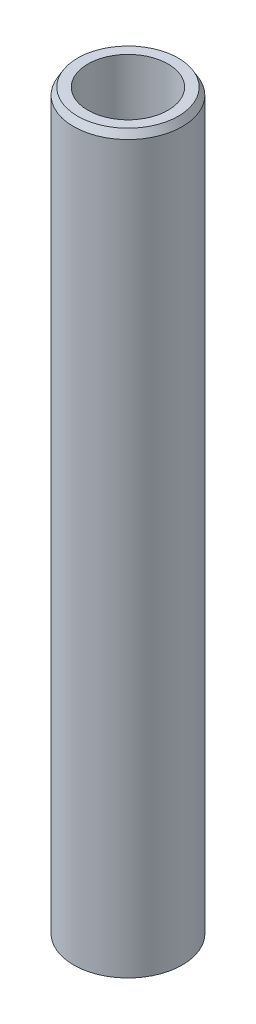
ISO-10303-21;
HEADER;
FILE_DESCRIPTION(('STEP AP214'),'2;1');
FILE_NAME('part.step','',(''),(''),'','','');
FILE_SCHEMA(('AUTOMOTIVE_DESIGN { 1 0 10303 214 1 1 1 1 }'));
ENDSEC;
DATA;
#1=APPLICATION_CONTEXT('core data for automotive mechanical design processes');
#2=APPLICATION_PROTOCOL_DEFINITION('international standard','automotive_design',2000,#1);
#3=PRODUCT_CONTEXT('',#1,'mechanical');
#4=PRODUCT('Part','Part','',(#3));
#5=PRODUCT_RELATED_PRODUCT_CATEGORY('part','',(#4));
#6=PRODUCT_DEFINITION_FORMATION('','',#4);
#7=PRODUCT_DEFINITION_CONTEXT('part definition',#1,'design');
#8=PRODUCT_DEFINITION('design','',#6,#7);
#9=PRODUCT_DEFINITION_SHAPE('','',#8);
#10=(LENGTH_UNIT() NAMED_UNIT(*) SI_UNIT(.MILLI.,.METRE.));
#11=(NAMED_UNIT(*) PLANE_ANGLE_UNIT() SI_UNIT($,.RADIAN.));
#12=(NAMED_UNIT(*) SI_UNIT($,.STERADIAN.) SOLID_ANGLE_UNIT());
#13=UNCERTAINTY_MEASURE_WITH_UNIT(LENGTH_MEASURE(1.E-05),#10,'distance_accuracy_value','');
#14=(GEOMETRIC_REPRESENTATION_CONTEXT(3) GLOBAL_UNCERTAINTY_ASSIGNED_CONTEXT((#13)) GLOBAL_UNIT_ASSIGNED_CONTEXT((#10,
#11,#12)) REPRESENTATION_CONTEXT('',''));
#15=CARTESIAN_POINT('',(0.,0.,0.));
#16=DIRECTION('',(0.,0.,1.));
#17=DIRECTION('',(1.,0.,0.));
#18=AXIS2_PLACEMENT_3D('',#15,#16,#17);
#19=CARTESIAN_POINT('',(0.,508.202251335451,0.));
#20=DIRECTION('',(0.,-1.,0.));
#21=DIRECTION('',(0.,0.,-1.));
#22=AXIS2_PLACEMENT_3D('',#19,#20,#21);
#23=CYLINDRICAL_SURFACE('',#22,37.5);
#24=CARTESIAN_POINT('',(0.,503.381000509019,0.));
#25=DIRECTION('',(0.,1.,0.));
#26=DIRECTION('',(0.,0.,1.));
#27=AXIS2_PLACEMENT_3D('',#24,#25,#26);
#28=CIRCLE('',#27,37.5);
#29=CARTESIAN_POINT('',(0.,503.381000509019,37.5));
#30=VERTEX_POINT('',#29);
#31=EDGE_CURVE('E50',#30,#30,#28,.F.);
#32=ORIENTED_EDGE('',*,*,#31,.T.);
#33=EDGE_LOOP('',(#32));
#34=FACE_BOUND('',#33,.T.);
#35=CARTESIAN_POINT('',(0.,2.78355046247136,0.));
#36=DIRECTION('',(0.,1.,0.));
#37=DIRECTION('',(0.,0.,1.));
#38=AXIS2_PLACEMENT_3D('',#35,#36,#37);
#39=CIRCLE('',#38,37.5);
#40=CARTESIAN_POINT('',(0.,2.78355046247136,37.5));
#41=VERTEX_POINT('',#40);
#42=EDGE_CURVE('E51',#41,#41,#39,.T.);
#43=ORIENTED_EDGE('',*,*,#42,.T.);
#44=EDGE_LOOP('',(#43));
#45=FACE_BOUND('',#44,.T.);
#46=ADVANCED_FACE('F39',(#34,#45),#23,.T.);
#47=CARTESIAN_POINT('',(0.,508.202251335451,0.));
#48=DIRECTION('',(0.,1.,0.));
#49=DIRECTION('',(0.,0.,1.));
#50=AXIS2_PLACEMENT_3D('',#47,#48,#49);
#51=PLANE('',#50);
#52=CARTESIAN_POINT('',(0.,508.202251335451,0.));
#53=DIRECTION('',(0.,1.,0.));
#54=DIRECTION('',(0.,0.,1.));
#55=AXIS2_PLACEMENT_3D('',#52,#53,#54);
#56=CIRCLE('',#55,34.7164495375286);
#57=CARTESIAN_POINT('',(0.,508.202251335451,34.7164495375286));
#58=VERTEX_POINT('',#57);
#59=EDGE_CURVE('E54',#58,#58,#56,.T.);
#60=ORIENTED_EDGE('',*,*,#59,.T.);
#61=EDGE_LOOP('',(#60));
#62=FACE_BOUND('',#61,.T.);
#63=CARTESIAN_POINT('',(0.,508.202251335451,0.));
#64=DIRECTION('',(0.,1.,0.));
#65=DIRECTION('',(0.,0.,1.));
#66=AXIS2_PLACEMENT_3D('',#63,#64,#65);
#67=CIRCLE('',#66,27.6466497342233);
#68=CARTESIAN_POINT('',(0.,508.202251335451,27.6466497342233));
#69=VERTEX_POINT('',#68);
#70=EDGE_CURVE('E58',#69,#69,#67,.T.);
#71=ORIENTED_EDGE('',*,*,#70,.F.);
#72=EDGE_LOOP('',(#71));
#73=FACE_BOUND('',#72,.T.);
#74=ADVANCED_FACE('F69',(#62,#73),#51,.T.);
#75=CARTESIAN_POINT('',(0.,0.,0.));
#76=DIRECTION('',(0.,1.,0.));
#77=DIRECTION('',(0.,0.,1.));
#78=AXIS2_PLACEMENT_3D('',#75,#76,#77);
#79=PLANE('',#78);
#80=CARTESIAN_POINT('',(0.,0.,0.));
#81=DIRECTION('',(0.,1.,0.));
#82=DIRECTION('',(0.,0.,1.));
#83=AXIS2_PLACEMENT_3D('',#80,#81,#82);
#84=CIRCLE('',#83,32.6787491735678);
#85=CARTESIAN_POINT('',(0.,0.,32.6787491735678));
#86=VERTEX_POINT('',#85);
#87=EDGE_CURVE('E10',#86,#86,#84,.F.);
#88=ORIENTED_EDGE('',*,*,#87,.T.);
#89=EDGE_LOOP('',(#88));
#90=FACE_BOUND('',#89,.T.);
#91=CARTESIAN_POINT('',(0.,0.,0.));
#92=DIRECTION('',(0.,1.,0.));
#93=DIRECTION('',(0.,0.,1.));
#94=AXIS2_PLACEMENT_3D('',#91,#92,#93);
#95=CIRCLE('',#94,27.6466497342233);
#96=CARTESIAN_POINT('',(0.,0.,27.6466497342233));
#97=VERTEX_POINT('',#96);
#98=EDGE_CURVE('E63',#97,#97,#95,.T.);
#99=ORIENTED_EDGE('',*,*,#98,.T.);
#100=EDGE_LOOP('',(#99));
#101=FACE_BOUND('',#100,.T.);
#102=ADVANCED_FACE('F75',(#90,#101),#79,.F.);
#103=CARTESIAN_POINT('',(0.,508.202251335451,0.));
#104=DIRECTION('',(0.,-1.,0.));
#105=DIRECTION('',(0.,0.,-1.));
#106=AXIS2_PLACEMENT_3D('',#103,#104,#105);
#107=CYLINDRICAL_SURFACE('',#106,27.6466497342233);
#108=ORIENTED_EDGE('',*,*,#70,.T.);
#109=EDGE_LOOP('',(#108));
#110=FACE_BOUND('',#109,.T.);
#111=ORIENTED_EDGE('',*,*,#98,.F.);
#112=EDGE_LOOP('',(#111));
#113=FACE_BOUND('',#112,.T.);
#114=ADVANCED_FACE('F70',(#110,#113),#107,.F.);
#115=CARTESIAN_POINT('',(0.,508.202251335451,0.));
#116=DIRECTION('',(0.,-1.,0.));
#117=DIRECTION('',(0.,0.,-1.));
#118=AXIS2_PLACEMENT_3D('',#115,#116,#117);
#119=CONICAL_SURFACE('',#118,34.7164495375286,0.523598775598302);
#120=ORIENTED_EDGE('',*,*,#31,.F.);
#121=EDGE_LOOP('',(#120));
#122=FACE_BOUND('',#121,.T.);
#123=ORIENTED_EDGE('',*,*,#59,.F.);
#124=EDGE_LOOP('',(#123));
#125=FACE_BOUND('',#124,.T.);
#126=ADVANCED_FACE('F81',(#122,#125),#119,.T.);
#127=CARTESIAN_POINT('',(0.,2.78355046247136,0.));
#128=DIRECTION('',(0.,1.,0.));
#129=DIRECTION('',(0.,0.,1.));
#130=AXIS2_PLACEMENT_3D('',#127,#128,#129);
#131=CONICAL_SURFACE('',#130,37.5,1.0471975511966);
#132=ORIENTED_EDGE('',*,*,#87,.F.);
#133=EDGE_LOOP('',(#132));
#134=FACE_BOUND('',#133,.T.);
#135=ORIENTED_EDGE('',*,*,#42,.F.);
#136=EDGE_LOOP('',(#135));
#137=FACE_BOUND('',#136,.T.);
#138=ADVANCED_FACE('F45',(#134,#137),#131,.T.);
#139=CLOSED_SHELL('',(#46,#74,#102,#114,#126,#138));
#140=MANIFOLD_SOLID_BREP('B2',#139);
#141=ADVANCED_BREP_SHAPE_REPRESENTATION('',(#18,#140),#14);
#142=SHAPE_DEFINITION_REPRESENTATION(#9,#141);
ENDSEC;
END-ISO-10303-21;
